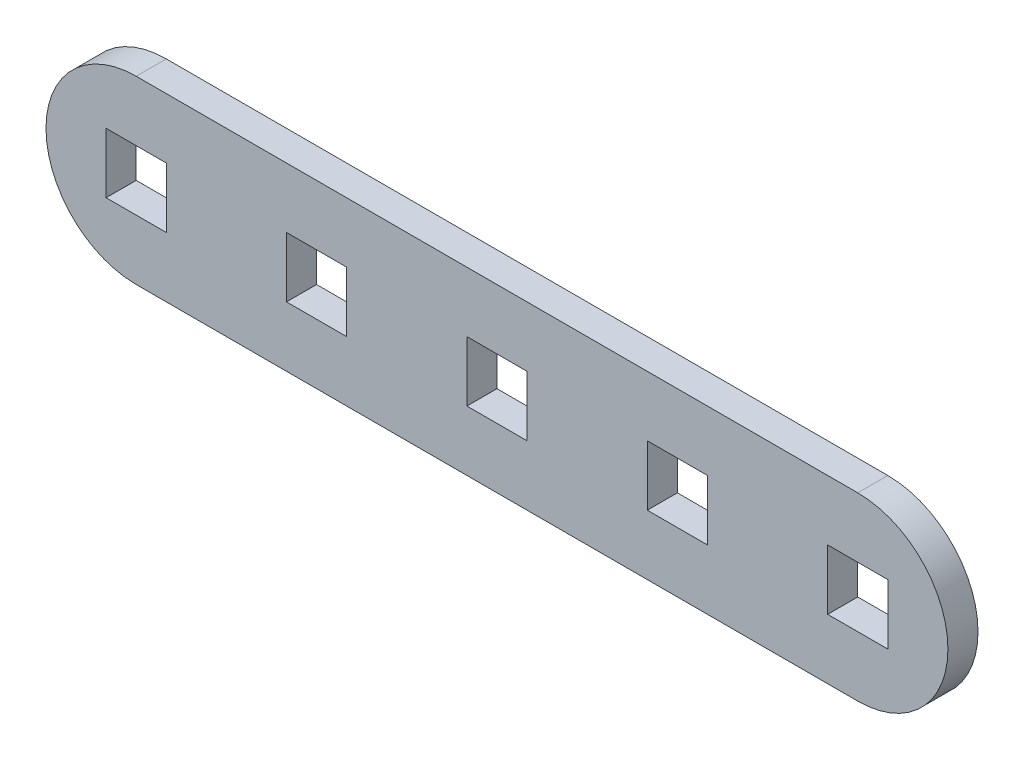
ISO-10303-21;
HEADER;
FILE_DESCRIPTION(('STEP AP214'),'2;1');
FILE_NAME('part.step','',(''),(''),'','','');
FILE_SCHEMA(('AUTOMOTIVE_DESIGN { 1 0 10303 214 1 1 1 1 }'));
ENDSEC;
DATA;
#1=APPLICATION_CONTEXT('core data for automotive mechanical design processes');
#2=APPLICATION_PROTOCOL_DEFINITION('international standard','automotive_design',2000,#1);
#3=PRODUCT_CONTEXT('',#1,'mechanical');
#4=PRODUCT('Part','Part','',(#3));
#5=PRODUCT_RELATED_PRODUCT_CATEGORY('part','',(#4));
#6=PRODUCT_DEFINITION_FORMATION('','',#4);
#7=PRODUCT_DEFINITION_CONTEXT('part definition',#1,'design');
#8=PRODUCT_DEFINITION('design','',#6,#7);
#9=PRODUCT_DEFINITION_SHAPE('','',#8);
#10=(LENGTH_UNIT() NAMED_UNIT(*) SI_UNIT(.MILLI.,.METRE.));
#11=(NAMED_UNIT(*) PLANE_ANGLE_UNIT() SI_UNIT($,.RADIAN.));
#12=(NAMED_UNIT(*) SI_UNIT($,.STERADIAN.) SOLID_ANGLE_UNIT());
#13=UNCERTAINTY_MEASURE_WITH_UNIT(LENGTH_MEASURE(1.E-05),#10,'distance_accuracy_value','');
#14=(GEOMETRIC_REPRESENTATION_CONTEXT(3) GLOBAL_UNCERTAINTY_ASSIGNED_CONTEXT((#13)) GLOBAL_UNIT_ASSIGNED_CONTEXT((#10,
#11,#12)) REPRESENTATION_CONTEXT('',''));
#15=CARTESIAN_POINT('',(0.,0.,0.));
#16=DIRECTION('',(0.,0.,1.));
#17=DIRECTION('',(1.,0.,0.));
#18=AXIS2_PLACEMENT_3D('',#15,#16,#17);
#19=CARTESIAN_POINT('',(47.4127492026,292.7399229362,1.5));
#20=DIRECTION('',(0.,0.,1.));
#21=DIRECTION('',(1.,0.,0.));
#22=AXIS2_PLACEMENT_3D('',#19,#20,#21);
#23=PLANE('',#22);
#24=DIRECTION('',(0.,-1.,0.));
#25=VECTOR('',#24,1.);
#26=CARTESIAN_POINT('',(36.9127492026,294.2399229362,1.5));
#27=LINE('',#26,#25);
#28=CARTESIAN_POINT('',(36.9127492026,294.2399229362,1.5));
#29=VERTEX_POINT('',#28);
#30=CARTESIAN_POINT('',(36.9127492026,291.2399229362,1.5));
#31=VERTEX_POINT('',#30);
#32=EDGE_CURVE('E232',#29,#31,#27,.T.);
#33=ORIENTED_EDGE('',*,*,#32,.F.);
#34=DIRECTION('',(-1.,0.,0.));
#35=VECTOR('',#34,1.);
#36=CARTESIAN_POINT('',(39.9127492026,294.2399229362,1.5));
#37=LINE('',#36,#35);
#38=CARTESIAN_POINT('',(39.9127492026,294.2399229362,1.5));
#39=VERTEX_POINT('',#38);
#40=EDGE_CURVE('E230',#39,#29,#37,.T.);
#41=ORIENTED_EDGE('',*,*,#40,.F.);
#42=DIRECTION('',(0.,1.,0.));
#43=VECTOR('',#42,1.);
#44=CARTESIAN_POINT('',(39.9127492026,291.2399229362,1.5));
#45=LINE('',#44,#43);
#46=CARTESIAN_POINT('',(39.9127492026,291.2399229362,1.5));
#47=VERTEX_POINT('',#46);
#48=EDGE_CURVE('E238',#47,#39,#45,.T.);
#49=ORIENTED_EDGE('',*,*,#48,.F.);
#50=DIRECTION('',(1.,0.,0.));
#51=VECTOR('',#50,1.);
#52=CARTESIAN_POINT('',(36.9127492026,291.2399229362,1.5));
#53=LINE('',#52,#51);
#54=EDGE_CURVE('E235',#31,#47,#53,.T.);
#55=ORIENTED_EDGE('',*,*,#54,.F.);
#56=EDGE_LOOP('',(#33,#41,#49,#55));
#57=FACE_BOUND('',#56,.T.);
#58=DIRECTION('',(0.,-1.,0.));
#59=VECTOR('',#58,1.);
#60=CARTESIAN_POINT('',(18.9127492026,294.2399229362,1.5));
#61=LINE('',#60,#59);
#62=CARTESIAN_POINT('',(18.9127492026,294.2399229362,1.5));
#63=VERTEX_POINT('',#62);
#64=CARTESIAN_POINT('',(18.9127492026,291.2399229362,1.5));
#65=VERTEX_POINT('',#64);
#66=EDGE_CURVE('E294',#63,#65,#61,.T.);
#67=ORIENTED_EDGE('',*,*,#66,.F.);
#68=DIRECTION('',(-1.,0.,0.));
#69=VECTOR('',#68,1.);
#70=CARTESIAN_POINT('',(21.9127492026,294.2399229362,1.5));
#71=LINE('',#70,#69);
#72=CARTESIAN_POINT('',(21.9127492026,294.2399229362,1.5));
#73=VERTEX_POINT('',#72);
#74=EDGE_CURVE('E292',#73,#63,#71,.T.);
#75=ORIENTED_EDGE('',*,*,#74,.F.);
#76=DIRECTION('',(0.,1.,0.));
#77=VECTOR('',#76,1.);
#78=CARTESIAN_POINT('',(21.9127492026,291.2399229362,1.5));
#79=LINE('',#78,#77);
#80=CARTESIAN_POINT('',(21.9127492026,291.2399229362,1.5));
#81=VERTEX_POINT('',#80);
#82=EDGE_CURVE('E300',#81,#73,#79,.T.);
#83=ORIENTED_EDGE('',*,*,#82,.F.);
#84=DIRECTION('',(1.,0.,0.));
#85=VECTOR('',#84,1.);
#86=CARTESIAN_POINT('',(18.9127492026,291.2399229362,1.5));
#87=LINE('',#86,#85);
#88=EDGE_CURVE('E297',#65,#81,#87,.T.);
#89=ORIENTED_EDGE('',*,*,#88,.F.);
#90=EDGE_LOOP('',(#67,#75,#83,#89));
#91=FACE_BOUND('',#90,.T.);
#92=CARTESIAN_POINT('',(47.4127492026,292.7399229362,1.5));
#93=DIRECTION('',(0.,0.,1.));
#94=DIRECTION('',(1.,0.,0.));
#95=AXIS2_PLACEMENT_3D('',#92,#93,#94);
#96=CIRCLE('',#95,4.5);
#97=CARTESIAN_POINT('',(47.4127492026,288.2399229362,1.5));
#98=VERTEX_POINT('',#97);
#99=CARTESIAN_POINT('',(47.4127492026,297.2399229362,1.5));
#100=VERTEX_POINT('',#99);
#101=EDGE_CURVE('E354',#98,#100,#96,.T.);
#102=ORIENTED_EDGE('',*,*,#101,.T.);
#103=DIRECTION('',(-1.,0.,0.));
#104=VECTOR('',#103,1.);
#105=CARTESIAN_POINT('',(11.4127492026,297.2399229362,1.5));
#106=LINE('',#105,#104);
#107=CARTESIAN_POINT('',(11.4127492026,297.2399229362,1.5));
#108=VERTEX_POINT('',#107);
#109=EDGE_CURVE('E357',#100,#108,#106,.T.);
#110=ORIENTED_EDGE('',*,*,#109,.T.);
#111=CARTESIAN_POINT('',(11.4127492026,292.7399229362,1.5));
#112=DIRECTION('',(0.,0.,1.));
#113=DIRECTION('',(1.,0.,0.));
#114=AXIS2_PLACEMENT_3D('',#111,#112,#113);
#115=CIRCLE('',#114,4.5);
#116=CARTESIAN_POINT('',(11.4127492026,288.2399229362,1.5));
#117=VERTEX_POINT('',#116);
#118=EDGE_CURVE('E360',#108,#117,#115,.T.);
#119=ORIENTED_EDGE('',*,*,#118,.T.);
#120=DIRECTION('',(1.,0.,0.));
#121=VECTOR('',#120,1.);
#122=CARTESIAN_POINT('',(11.4127492026,288.2399229362,1.5));
#123=LINE('',#122,#121);
#124=EDGE_CURVE('E362',#117,#98,#123,.T.);
#125=ORIENTED_EDGE('',*,*,#124,.T.);
#126=EDGE_LOOP('',(#102,#110,#119,#125));
#127=FACE_BOUND('',#126,.T.);
#128=DIRECTION('',(0.,-1.,0.));
#129=VECTOR('',#128,1.);
#130=CARTESIAN_POINT('',(9.9127492026,294.2399229362,1.5));
#131=LINE('',#130,#129);
#132=CARTESIAN_POINT('',(9.9127492026,294.2399229362,1.5));
#133=VERTEX_POINT('',#132);
#134=CARTESIAN_POINT('',(9.9127492026,291.2399229362,1.5));
#135=VERTEX_POINT('',#134);
#136=EDGE_CURVE('E325',#133,#135,#131,.T.);
#137=ORIENTED_EDGE('',*,*,#136,.F.);
#138=DIRECTION('',(-1.,0.,0.));
#139=VECTOR('',#138,1.);
#140=CARTESIAN_POINT('',(12.9127492026,294.2399229362,1.5));
#141=LINE('',#140,#139);
#142=CARTESIAN_POINT('',(12.9127492026,294.2399229362,1.5));
#143=VERTEX_POINT('',#142);
#144=EDGE_CURVE('E323',#143,#133,#141,.T.);
#145=ORIENTED_EDGE('',*,*,#144,.F.);
#146=DIRECTION('',(0.,1.,0.));
#147=VECTOR('',#146,1.);
#148=CARTESIAN_POINT('',(12.9127492026,291.2399229362,1.5));
#149=LINE('',#148,#147);
#150=CARTESIAN_POINT('',(12.9127492026,291.2399229362,1.5));
#151=VERTEX_POINT('',#150);
#152=EDGE_CURVE('E331',#151,#143,#149,.T.);
#153=ORIENTED_EDGE('',*,*,#152,.F.);
#154=DIRECTION('',(1.,0.,0.));
#155=VECTOR('',#154,1.);
#156=CARTESIAN_POINT('',(9.9127492026,291.2399229362,1.5));
#157=LINE('',#156,#155);
#158=EDGE_CURVE('E328',#135,#151,#157,.T.);
#159=ORIENTED_EDGE('',*,*,#158,.F.);
#160=EDGE_LOOP('',(#137,#145,#153,#159));
#161=FACE_BOUND('',#160,.T.);
#162=DIRECTION('',(0.,-1.,0.));
#163=VECTOR('',#162,1.);
#164=CARTESIAN_POINT('',(27.9127492026,294.2399229362,1.5));
#165=LINE('',#164,#163);
#166=CARTESIAN_POINT('',(27.9127492026,294.2399229362,1.5));
#167=VERTEX_POINT('',#166);
#168=CARTESIAN_POINT('',(27.9127492026,291.2399229362,1.5));
#169=VERTEX_POINT('',#168);
#170=EDGE_CURVE('E263',#167,#169,#165,.T.);
#171=ORIENTED_EDGE('',*,*,#170,.F.);
#172=DIRECTION('',(-1.,0.,0.));
#173=VECTOR('',#172,1.);
#174=CARTESIAN_POINT('',(30.9127492026,294.2399229362,1.5));
#175=LINE('',#174,#173);
#176=CARTESIAN_POINT('',(30.9127492026,294.2399229362,1.5));
#177=VERTEX_POINT('',#176);
#178=EDGE_CURVE('E261',#177,#167,#175,.T.);
#179=ORIENTED_EDGE('',*,*,#178,.F.);
#180=DIRECTION('',(0.,1.,0.));
#181=VECTOR('',#180,1.);
#182=CARTESIAN_POINT('',(30.9127492026,291.2399229362,1.5));
#183=LINE('',#182,#181);
#184=CARTESIAN_POINT('',(30.9127492026,291.2399229362,1.5));
#185=VERTEX_POINT('',#184);
#186=EDGE_CURVE('E269',#185,#177,#183,.T.);
#187=ORIENTED_EDGE('',*,*,#186,.F.);
#188=DIRECTION('',(1.,0.,0.));
#189=VECTOR('',#188,1.);
#190=CARTESIAN_POINT('',(27.9127492026,291.2399229362,1.5));
#191=LINE('',#190,#189);
#192=EDGE_CURVE('E266',#169,#185,#191,.T.);
#193=ORIENTED_EDGE('',*,*,#192,.F.);
#194=EDGE_LOOP('',(#171,#179,#187,#193));
#195=FACE_BOUND('',#194,.T.);
#196=DIRECTION('',(0.,-1.,0.));
#197=VECTOR('',#196,1.);
#198=CARTESIAN_POINT('',(45.9127492026,294.2399229362,1.5));
#199=LINE('',#198,#197);
#200=CARTESIAN_POINT('',(45.9127492026,294.2399229362,1.5));
#201=VERTEX_POINT('',#200);
#202=CARTESIAN_POINT('',(45.9127492026,291.2399229362,1.5));
#203=VERTEX_POINT('',#202);
#204=EDGE_CURVE('E202',#201,#203,#199,.T.);
#205=ORIENTED_EDGE('',*,*,#204,.F.);
#206=DIRECTION('',(-1.,0.,0.));
#207=VECTOR('',#206,1.);
#208=CARTESIAN_POINT('',(48.9127492026,294.2399229362,1.5));
#209=LINE('',#208,#207);
#210=CARTESIAN_POINT('',(48.9127492026,294.2399229362,1.5));
#211=VERTEX_POINT('',#210);
#212=EDGE_CURVE('E194',#211,#201,#209,.T.);
#213=ORIENTED_EDGE('',*,*,#212,.F.);
#214=DIRECTION('',(0.,1.,0.));
#215=VECTOR('',#214,1.);
#216=CARTESIAN_POINT('',(48.9127492026,291.2399229362,1.5));
#217=LINE('',#216,#215);
#218=CARTESIAN_POINT('',(48.9127492026,291.2399229362,1.5));
#219=VERTEX_POINT('',#218);
#220=EDGE_CURVE('E216',#219,#211,#217,.T.);
#221=ORIENTED_EDGE('',*,*,#220,.F.);
#222=DIRECTION('',(1.,0.,0.));
#223=VECTOR('',#222,1.);
#224=CARTESIAN_POINT('',(45.9127492026,291.2399229362,1.5));
#225=LINE('',#224,#223);
#226=EDGE_CURVE('E214',#203,#219,#225,.T.);
#227=ORIENTED_EDGE('',*,*,#226,.F.);
#228=EDGE_LOOP('',(#205,#213,#221,#227));
#229=FACE_BOUND('',#228,.T.);
#230=ADVANCED_FACE('F33',(#57,#91,#127,#161,#195,#229),#23,.T.);
#231=CARTESIAN_POINT('',(47.4127492026,292.7399229362,0.));
#232=DIRECTION('',(0.,0.,1.));
#233=DIRECTION('',(1.,0.,0.));
#234=AXIS2_PLACEMENT_3D('',#231,#232,#233);
#235=PLANE('',#234);
#236=DIRECTION('',(-1.,0.,0.));
#237=VECTOR('',#236,1.);
#238=CARTESIAN_POINT('',(39.9127492026,294.2399229362,0.));
#239=LINE('',#238,#237);
#240=CARTESIAN_POINT('',(39.9127492026,294.2399229362,0.));
#241=VERTEX_POINT('',#240);
#242=CARTESIAN_POINT('',(36.9127492026,294.2399229362,0.));
#243=VERTEX_POINT('',#242);
#244=EDGE_CURVE('E210',#241,#243,#239,.T.);
#245=ORIENTED_EDGE('',*,*,#244,.T.);
#246=DIRECTION('',(0.,-1.,0.));
#247=VECTOR('',#246,1.);
#248=CARTESIAN_POINT('',(36.9127492026,294.2399229362,0.));
#249=LINE('',#248,#247);
#250=CARTESIAN_POINT('',(36.9127492026,291.2399229362,0.));
#251=VERTEX_POINT('',#250);
#252=EDGE_CURVE('E243',#243,#251,#249,.T.);
#253=ORIENTED_EDGE('',*,*,#252,.T.);
#254=DIRECTION('',(1.,0.,0.));
#255=VECTOR('',#254,1.);
#256=CARTESIAN_POINT('',(36.9127492026,291.2399229362,0.));
#257=LINE('',#256,#255);
#258=CARTESIAN_POINT('',(39.9127492026,291.2399229362,0.));
#259=VERTEX_POINT('',#258);
#260=EDGE_CURVE('E246',#251,#259,#257,.T.);
#261=ORIENTED_EDGE('',*,*,#260,.T.);
#262=DIRECTION('',(0.,1.,0.));
#263=VECTOR('',#262,1.);
#264=CARTESIAN_POINT('',(39.9127492026,291.2399229362,0.));
#265=LINE('',#264,#263);
#266=EDGE_CURVE('E233',#259,#241,#265,.T.);
#267=ORIENTED_EDGE('',*,*,#266,.T.);
#268=EDGE_LOOP('',(#245,#253,#261,#267));
#269=FACE_BOUND('',#268,.T.);
#270=DIRECTION('',(-1.,0.,0.));
#271=VECTOR('',#270,1.);
#272=CARTESIAN_POINT('',(21.9127492026,294.2399229362,0.));
#273=LINE('',#272,#271);
#274=CARTESIAN_POINT('',(21.9127492026,294.2399229362,0.));
#275=VERTEX_POINT('',#274);
#276=CARTESIAN_POINT('',(18.9127492026,294.2399229362,0.));
#277=VERTEX_POINT('',#276);
#278=EDGE_CURVE('E291',#275,#277,#273,.T.);
#279=ORIENTED_EDGE('',*,*,#278,.T.);
#280=DIRECTION('',(0.,-1.,0.));
#281=VECTOR('',#280,1.);
#282=CARTESIAN_POINT('',(18.9127492026,294.2399229362,0.));
#283=LINE('',#282,#281);
#284=CARTESIAN_POINT('',(18.9127492026,291.2399229362,0.));
#285=VERTEX_POINT('',#284);
#286=EDGE_CURVE('E305',#277,#285,#283,.T.);
#287=ORIENTED_EDGE('',*,*,#286,.T.);
#288=DIRECTION('',(1.,0.,0.));
#289=VECTOR('',#288,1.);
#290=CARTESIAN_POINT('',(18.9127492026,291.2399229362,0.));
#291=LINE('',#290,#289);
#292=CARTESIAN_POINT('',(21.9127492026,291.2399229362,0.));
#293=VERTEX_POINT('',#292);
#294=EDGE_CURVE('E308',#285,#293,#291,.T.);
#295=ORIENTED_EDGE('',*,*,#294,.T.);
#296=DIRECTION('',(0.,1.,0.));
#297=VECTOR('',#296,1.);
#298=CARTESIAN_POINT('',(21.9127492026,291.2399229362,0.));
#299=LINE('',#298,#297);
#300=EDGE_CURVE('E295',#293,#275,#299,.T.);
#301=ORIENTED_EDGE('',*,*,#300,.T.);
#302=EDGE_LOOP('',(#279,#287,#295,#301));
#303=FACE_BOUND('',#302,.T.);
#304=CARTESIAN_POINT('',(47.4127492026,292.7399229362,0.));
#305=DIRECTION('',(0.,0.,1.));
#306=DIRECTION('',(1.,0.,0.));
#307=AXIS2_PLACEMENT_3D('',#304,#305,#306);
#308=CIRCLE('',#307,4.5);
#309=CARTESIAN_POINT('',(47.4127492026,288.2399229362,0.));
#310=VERTEX_POINT('',#309);
#311=CARTESIAN_POINT('',(47.4127492026,297.2399229362,0.));
#312=VERTEX_POINT('',#311);
#313=EDGE_CURVE('E353',#310,#312,#308,.T.);
#314=ORIENTED_EDGE('',*,*,#313,.F.);
#315=DIRECTION('',(1.,0.,0.));
#316=VECTOR('',#315,1.);
#317=CARTESIAN_POINT('',(11.4127492026,288.2399229362,0.));
#318=LINE('',#317,#316);
#319=CARTESIAN_POINT('',(11.4127492026,288.2399229362,0.));
#320=VERTEX_POINT('',#319);
#321=EDGE_CURVE('E358',#320,#310,#318,.T.);
#322=ORIENTED_EDGE('',*,*,#321,.F.);
#323=CARTESIAN_POINT('',(11.4127492026,292.7399229362,0.));
#324=DIRECTION('',(0.,0.,1.));
#325=DIRECTION('',(1.,0.,0.));
#326=AXIS2_PLACEMENT_3D('',#323,#324,#325);
#327=CIRCLE('',#326,4.5);
#328=CARTESIAN_POINT('',(11.4127492026,297.2399229362,0.));
#329=VERTEX_POINT('',#328);
#330=EDGE_CURVE('E369',#329,#320,#327,.T.);
#331=ORIENTED_EDGE('',*,*,#330,.F.);
#332=DIRECTION('',(-1.,0.,0.));
#333=VECTOR('',#332,1.);
#334=CARTESIAN_POINT('',(11.4127492026,297.2399229362,0.));
#335=LINE('',#334,#333);
#336=EDGE_CURVE('E367',#312,#329,#335,.T.);
#337=ORIENTED_EDGE('',*,*,#336,.F.);
#338=EDGE_LOOP('',(#314,#322,#331,#337));
#339=FACE_BOUND('',#338,.T.);
#340=DIRECTION('',(-1.,0.,0.));
#341=VECTOR('',#340,1.);
#342=CARTESIAN_POINT('',(12.9127492026,294.2399229362,0.));
#343=LINE('',#342,#341);
#344=CARTESIAN_POINT('',(12.9127492026,294.2399229362,0.));
#345=VERTEX_POINT('',#344);
#346=CARTESIAN_POINT('',(9.9127492026,294.2399229362,0.));
#347=VERTEX_POINT('',#346);
#348=EDGE_CURVE('E322',#345,#347,#343,.T.);
#349=ORIENTED_EDGE('',*,*,#348,.T.);
#350=DIRECTION('',(0.,-1.,0.));
#351=VECTOR('',#350,1.);
#352=CARTESIAN_POINT('',(9.9127492026,294.2399229362,0.));
#353=LINE('',#352,#351);
#354=CARTESIAN_POINT('',(9.9127492026,291.2399229362,0.));
#355=VERTEX_POINT('',#354);
#356=EDGE_CURVE('E336',#347,#355,#353,.T.);
#357=ORIENTED_EDGE('',*,*,#356,.T.);
#358=DIRECTION('',(1.,0.,0.));
#359=VECTOR('',#358,1.);
#360=CARTESIAN_POINT('',(9.9127492026,291.2399229362,0.));
#361=LINE('',#360,#359);
#362=CARTESIAN_POINT('',(12.9127492026,291.2399229362,0.));
#363=VERTEX_POINT('',#362);
#364=EDGE_CURVE('E339',#355,#363,#361,.T.);
#365=ORIENTED_EDGE('',*,*,#364,.T.);
#366=DIRECTION('',(0.,1.,0.));
#367=VECTOR('',#366,1.);
#368=CARTESIAN_POINT('',(12.9127492026,291.2399229362,0.));
#369=LINE('',#368,#367);
#370=EDGE_CURVE('E326',#363,#345,#369,.T.);
#371=ORIENTED_EDGE('',*,*,#370,.T.);
#372=EDGE_LOOP('',(#349,#357,#365,#371));
#373=FACE_BOUND('',#372,.T.);
#374=DIRECTION('',(-1.,0.,0.));
#375=VECTOR('',#374,1.);
#376=CARTESIAN_POINT('',(30.9127492026,294.2399229362,0.));
#377=LINE('',#376,#375);
#378=CARTESIAN_POINT('',(30.9127492026,294.2399229362,0.));
#379=VERTEX_POINT('',#378);
#380=CARTESIAN_POINT('',(27.9127492026,294.2399229362,0.));
#381=VERTEX_POINT('',#380);
#382=EDGE_CURVE('E260',#379,#381,#377,.T.);
#383=ORIENTED_EDGE('',*,*,#382,.T.);
#384=DIRECTION('',(0.,-1.,0.));
#385=VECTOR('',#384,1.);
#386=CARTESIAN_POINT('',(27.9127492026,294.2399229362,0.));
#387=LINE('',#386,#385);
#388=CARTESIAN_POINT('',(27.9127492026,291.2399229362,0.));
#389=VERTEX_POINT('',#388);
#390=EDGE_CURVE('E274',#381,#389,#387,.T.);
#391=ORIENTED_EDGE('',*,*,#390,.T.);
#392=DIRECTION('',(1.,0.,0.));
#393=VECTOR('',#392,1.);
#394=CARTESIAN_POINT('',(27.9127492026,291.2399229362,0.));
#395=LINE('',#394,#393);
#396=CARTESIAN_POINT('',(30.9127492026,291.2399229362,0.));
#397=VERTEX_POINT('',#396);
#398=EDGE_CURVE('E277',#389,#397,#395,.T.);
#399=ORIENTED_EDGE('',*,*,#398,.T.);
#400=DIRECTION('',(0.,1.,0.));
#401=VECTOR('',#400,1.);
#402=CARTESIAN_POINT('',(30.9127492026,291.2399229362,0.));
#403=LINE('',#402,#401);
#404=EDGE_CURVE('E264',#397,#379,#403,.T.);
#405=ORIENTED_EDGE('',*,*,#404,.T.);
#406=EDGE_LOOP('',(#383,#391,#399,#405));
#407=FACE_BOUND('',#406,.T.);
#408=DIRECTION('',(-1.,0.,0.));
#409=VECTOR('',#408,1.);
#410=CARTESIAN_POINT('',(48.9127492026,294.2399229362,0.));
#411=LINE('',#410,#409);
#412=CARTESIAN_POINT('',(48.9127492026,294.2399229362,0.));
#413=VERTEX_POINT('',#412);
#414=CARTESIAN_POINT('',(45.9127492026,294.2399229362,0.));
#415=VERTEX_POINT('',#414);
#416=EDGE_CURVE('E56',#413,#415,#411,.T.);
#417=ORIENTED_EDGE('',*,*,#416,.T.);
#418=DIRECTION('',(0.,-1.,0.));
#419=VECTOR('',#418,1.);
#420=CARTESIAN_POINT('',(45.9127492026,294.2399229362,0.));
#421=LINE('',#420,#419);
#422=CARTESIAN_POINT('',(45.9127492026,291.2399229362,0.));
#423=VERTEX_POINT('',#422);
#424=EDGE_CURVE('E209',#415,#423,#421,.T.);
#425=ORIENTED_EDGE('',*,*,#424,.T.);
#426=DIRECTION('',(1.,0.,0.));
#427=VECTOR('',#426,1.);
#428=CARTESIAN_POINT('',(45.9127492026,291.2399229362,0.));
#429=LINE('',#428,#427);
#430=CARTESIAN_POINT('',(48.9127492026,291.2399229362,0.));
#431=VERTEX_POINT('',#430);
#432=EDGE_CURVE('E222',#423,#431,#429,.T.);
#433=ORIENTED_EDGE('',*,*,#432,.T.);
#434=DIRECTION('',(0.,1.,0.));
#435=VECTOR('',#434,1.);
#436=CARTESIAN_POINT('',(48.9127492026,291.2399229362,0.));
#437=LINE('',#436,#435);
#438=EDGE_CURVE('E203',#431,#413,#437,.T.);
#439=ORIENTED_EDGE('',*,*,#438,.T.);
#440=EDGE_LOOP('',(#417,#425,#433,#439));
#441=FACE_BOUND('',#440,.T.);
#442=ADVANCED_FACE('F387',(#269,#303,#339,#373,#407,#441),#235,.F.);
#443=CARTESIAN_POINT('',(47.4127492026,292.7399229362,1.5));
#444=DIRECTION('',(0.,0.,-1.));
#445=DIRECTION('',(-1.,0.,0.));
#446=AXIS2_PLACEMENT_3D('',#443,#444,#445);
#447=CYLINDRICAL_SURFACE('',#446,4.5);
#448=ORIENTED_EDGE('',*,*,#313,.T.);
#449=DIRECTION('',(0.,0.,-1.));
#450=VECTOR('',#449,1.);
#451=CARTESIAN_POINT('',(47.4127492026,297.2399229362,1.5));
#452=LINE('',#451,#450);
#453=EDGE_CURVE('E11',#100,#312,#452,.T.);
#454=ORIENTED_EDGE('',*,*,#453,.F.);
#455=ORIENTED_EDGE('',*,*,#101,.F.);
#456=DIRECTION('',(0.,0.,-1.));
#457=VECTOR('',#456,1.);
#458=CARTESIAN_POINT('',(47.4127492026,288.2399229362,1.5));
#459=LINE('',#458,#457);
#460=EDGE_CURVE('E364',#98,#310,#459,.T.);
#461=ORIENTED_EDGE('',*,*,#460,.T.);
#462=EDGE_LOOP('',(#448,#454,#455,#461));
#463=FACE_BOUND('',#462,.T.);
#464=ADVANCED_FACE('F35',(#463),#447,.T.);
#465=CARTESIAN_POINT('',(11.4127492026,297.2399229362,1.5));
#466=DIRECTION('',(0.,-1.,0.));
#467=DIRECTION('',(0.,0.,-1.));
#468=AXIS2_PLACEMENT_3D('',#465,#466,#467);
#469=PLANE('',#468);
#470=ORIENTED_EDGE('',*,*,#336,.T.);
#471=DIRECTION('',(0.,0.,-1.));
#472=VECTOR('',#471,1.);
#473=CARTESIAN_POINT('',(11.4127492026,297.2399229362,1.5));
#474=LINE('',#473,#472);
#475=EDGE_CURVE('E41',#108,#329,#474,.T.);
#476=ORIENTED_EDGE('',*,*,#475,.F.);
#477=ORIENTED_EDGE('',*,*,#109,.F.);
#478=ORIENTED_EDGE('',*,*,#453,.T.);
#479=EDGE_LOOP('',(#470,#476,#477,#478));
#480=FACE_BOUND('',#479,.T.);
#481=ADVANCED_FACE('F398',(#480),#469,.F.);
#482=CARTESIAN_POINT('',(11.4127492026,292.7399229362,1.5));
#483=DIRECTION('',(0.,0.,-1.));
#484=DIRECTION('',(-1.,0.,0.));
#485=AXIS2_PLACEMENT_3D('',#482,#483,#484);
#486=CYLINDRICAL_SURFACE('',#485,4.5);
#487=ORIENTED_EDGE('',*,*,#330,.T.);
#488=DIRECTION('',(0.,0.,-1.));
#489=VECTOR('',#488,1.);
#490=CARTESIAN_POINT('',(11.4127492026,288.2399229362,1.5));
#491=LINE('',#490,#489);
#492=EDGE_CURVE('E374',#117,#320,#491,.T.);
#493=ORIENTED_EDGE('',*,*,#492,.F.);
#494=ORIENTED_EDGE('',*,*,#118,.F.);
#495=ORIENTED_EDGE('',*,*,#475,.T.);
#496=EDGE_LOOP('',(#487,#493,#494,#495));
#497=FACE_BOUND('',#496,.T.);
#498=ADVANCED_FACE('F381',(#497),#486,.T.);
#499=CARTESIAN_POINT('',(11.4127492026,288.2399229362,1.5));
#500=DIRECTION('',(0.,1.,0.));
#501=DIRECTION('',(0.,0.,1.));
#502=AXIS2_PLACEMENT_3D('',#499,#500,#501);
#503=PLANE('',#502);
#504=ORIENTED_EDGE('',*,*,#321,.T.);
#505=ORIENTED_EDGE('',*,*,#460,.F.);
#506=ORIENTED_EDGE('',*,*,#124,.F.);
#507=ORIENTED_EDGE('',*,*,#492,.T.);
#508=EDGE_LOOP('',(#504,#505,#506,#507));
#509=FACE_BOUND('',#508,.T.);
#510=ADVANCED_FACE('F391',(#509),#503,.F.);
#511=CARTESIAN_POINT('',(12.9127492026,294.2399229362,1.5));
#512=DIRECTION('',(0.,-1.,0.));
#513=DIRECTION('',(0.,0.,-1.));
#514=AXIS2_PLACEMENT_3D('',#511,#512,#513);
#515=PLANE('',#514);
#516=ORIENTED_EDGE('',*,*,#348,.F.);
#517=DIRECTION('',(0.,0.,-1.));
#518=VECTOR('',#517,1.);
#519=CARTESIAN_POINT('',(12.9127492026,294.2399229362,1.5));
#520=LINE('',#519,#518);
#521=EDGE_CURVE('E333',#143,#345,#520,.T.);
#522=ORIENTED_EDGE('',*,*,#521,.F.);
#523=ORIENTED_EDGE('',*,*,#144,.T.);
#524=DIRECTION('',(0.,0.,-1.));
#525=VECTOR('',#524,1.);
#526=CARTESIAN_POINT('',(9.9127492026,294.2399229362,1.5));
#527=LINE('',#526,#525);
#528=EDGE_CURVE('E350',#133,#347,#527,.T.);
#529=ORIENTED_EDGE('',*,*,#528,.T.);
#530=EDGE_LOOP('',(#516,#522,#523,#529));
#531=FACE_BOUND('',#530,.T.);
#532=ADVANCED_FACE('F416',(#531),#515,.T.);
#533=CARTESIAN_POINT('',(9.9127492026,294.2399229362,1.5));
#534=DIRECTION('',(1.,0.,0.));
#535=DIRECTION('',(0.,0.,-1.));
#536=AXIS2_PLACEMENT_3D('',#533,#534,#535);
#537=PLANE('',#536);
#538=ORIENTED_EDGE('',*,*,#356,.F.);
#539=ORIENTED_EDGE('',*,*,#528,.F.);
#540=ORIENTED_EDGE('',*,*,#136,.T.);
#541=DIRECTION('',(0.,0.,-1.));
#542=VECTOR('',#541,1.);
#543=CARTESIAN_POINT('',(9.9127492026,291.2399229362,1.5));
#544=LINE('',#543,#542);
#545=EDGE_CURVE('E348',#135,#355,#544,.T.);
#546=ORIENTED_EDGE('',*,*,#545,.T.);
#547=EDGE_LOOP('',(#538,#539,#540,#546));
#548=FACE_BOUND('',#547,.T.);
#549=ADVANCED_FACE('F423',(#548),#537,.T.);
#550=CARTESIAN_POINT('',(9.9127492026,291.2399229362,1.5));
#551=DIRECTION('',(0.,1.,0.));
#552=DIRECTION('',(0.,0.,1.));
#553=AXIS2_PLACEMENT_3D('',#550,#551,#552);
#554=PLANE('',#553);
#555=ORIENTED_EDGE('',*,*,#364,.F.);
#556=ORIENTED_EDGE('',*,*,#545,.F.);
#557=ORIENTED_EDGE('',*,*,#158,.T.);
#558=DIRECTION('',(0.,0.,-1.));
#559=VECTOR('',#558,1.);
#560=CARTESIAN_POINT('',(12.9127492026,291.2399229362,1.5));
#561=LINE('',#560,#559);
#562=EDGE_CURVE('E346',#151,#363,#561,.T.);
#563=ORIENTED_EDGE('',*,*,#562,.T.);
#564=EDGE_LOOP('',(#555,#556,#557,#563));
#565=FACE_BOUND('',#564,.T.);
#566=ADVANCED_FACE('F428',(#565),#554,.T.);
#567=CARTESIAN_POINT('',(12.9127492026,291.2399229362,1.5));
#568=DIRECTION('',(-1.,0.,0.));
#569=DIRECTION('',(0.,0.,1.));
#570=AXIS2_PLACEMENT_3D('',#567,#568,#569);
#571=PLANE('',#570);
#572=ORIENTED_EDGE('',*,*,#370,.F.);
#573=ORIENTED_EDGE('',*,*,#562,.F.);
#574=ORIENTED_EDGE('',*,*,#152,.T.);
#575=ORIENTED_EDGE('',*,*,#521,.T.);
#576=EDGE_LOOP('',(#572,#573,#574,#575));
#577=FACE_BOUND('',#576,.T.);
#578=ADVANCED_FACE('F435',(#577),#571,.T.);
#579=CARTESIAN_POINT('',(21.9127492026,294.2399229362,1.5));
#580=DIRECTION('',(0.,-1.,0.));
#581=DIRECTION('',(0.,0.,-1.));
#582=AXIS2_PLACEMENT_3D('',#579,#580,#581);
#583=PLANE('',#582);
#584=ORIENTED_EDGE('',*,*,#278,.F.);
#585=DIRECTION('',(0.,0.,-1.));
#586=VECTOR('',#585,1.);
#587=CARTESIAN_POINT('',(21.9127492026,294.2399229362,1.5));
#588=LINE('',#587,#586);
#589=EDGE_CURVE('E302',#73,#275,#588,.T.);
#590=ORIENTED_EDGE('',*,*,#589,.F.);
#591=ORIENTED_EDGE('',*,*,#74,.T.);
#592=DIRECTION('',(0.,0.,-1.));
#593=VECTOR('',#592,1.);
#594=CARTESIAN_POINT('',(18.9127492026,294.2399229362,1.5));
#595=LINE('',#594,#593);
#596=EDGE_CURVE('E319',#63,#277,#595,.T.);
#597=ORIENTED_EDGE('',*,*,#596,.T.);
#598=EDGE_LOOP('',(#584,#590,#591,#597));
#599=FACE_BOUND('',#598,.T.);
#600=ADVANCED_FACE('F490',(#599),#583,.T.);
#601=CARTESIAN_POINT('',(18.9127492026,294.2399229362,1.5));
#602=DIRECTION('',(1.,0.,0.));
#603=DIRECTION('',(0.,0.,-1.));
#604=AXIS2_PLACEMENT_3D('',#601,#602,#603);
#605=PLANE('',#604);
#606=ORIENTED_EDGE('',*,*,#286,.F.);
#607=ORIENTED_EDGE('',*,*,#596,.F.);
#608=ORIENTED_EDGE('',*,*,#66,.T.);
#609=DIRECTION('',(0.,0.,-1.));
#610=VECTOR('',#609,1.);
#611=CARTESIAN_POINT('',(18.9127492026,291.2399229362,1.5));
#612=LINE('',#611,#610);
#613=EDGE_CURVE('E317',#65,#285,#612,.T.);
#614=ORIENTED_EDGE('',*,*,#613,.T.);
#615=EDGE_LOOP('',(#606,#607,#608,#614));
#616=FACE_BOUND('',#615,.T.);
#617=ADVANCED_FACE('F486',(#616),#605,.T.);
#618=CARTESIAN_POINT('',(18.9127492026,291.2399229362,1.5));
#619=DIRECTION('',(0.,1.,0.));
#620=DIRECTION('',(0.,0.,1.));
#621=AXIS2_PLACEMENT_3D('',#618,#619,#620);
#622=PLANE('',#621);
#623=ORIENTED_EDGE('',*,*,#294,.F.);
#624=ORIENTED_EDGE('',*,*,#613,.F.);
#625=ORIENTED_EDGE('',*,*,#88,.T.);
#626=DIRECTION('',(0.,0.,-1.));
#627=VECTOR('',#626,1.);
#628=CARTESIAN_POINT('',(21.9127492026,291.2399229362,1.5));
#629=LINE('',#628,#627);
#630=EDGE_CURVE('E315',#81,#293,#629,.T.);
#631=ORIENTED_EDGE('',*,*,#630,.T.);
#632=EDGE_LOOP('',(#623,#624,#625,#631));
#633=FACE_BOUND('',#632,.T.);
#634=ADVANCED_FACE('F482',(#633),#622,.T.);
#635=CARTESIAN_POINT('',(21.9127492026,291.2399229362,1.5));
#636=DIRECTION('',(-1.,0.,0.));
#637=DIRECTION('',(0.,0.,1.));
#638=AXIS2_PLACEMENT_3D('',#635,#636,#637);
#639=PLANE('',#638);
#640=ORIENTED_EDGE('',*,*,#300,.F.);
#641=ORIENTED_EDGE('',*,*,#630,.F.);
#642=ORIENTED_EDGE('',*,*,#82,.T.);
#643=ORIENTED_EDGE('',*,*,#589,.T.);
#644=EDGE_LOOP('',(#640,#641,#642,#643));
#645=FACE_BOUND('',#644,.T.);
#646=ADVANCED_FACE('F479',(#645),#639,.T.);
#647=CARTESIAN_POINT('',(30.9127492026,294.2399229362,1.5));
#648=DIRECTION('',(0.,-1.,0.));
#649=DIRECTION('',(0.,0.,-1.));
#650=AXIS2_PLACEMENT_3D('',#647,#648,#649);
#651=PLANE('',#650);
#652=ORIENTED_EDGE('',*,*,#382,.F.);
#653=DIRECTION('',(0.,0.,-1.));
#654=VECTOR('',#653,1.);
#655=CARTESIAN_POINT('',(30.9127492026,294.2399229362,1.5));
#656=LINE('',#655,#654);
#657=EDGE_CURVE('E271',#177,#379,#656,.T.);
#658=ORIENTED_EDGE('',*,*,#657,.F.);
#659=ORIENTED_EDGE('',*,*,#178,.T.);
#660=DIRECTION('',(0.,0.,-1.));
#661=VECTOR('',#660,1.);
#662=CARTESIAN_POINT('',(27.9127492026,294.2399229362,1.5));
#663=LINE('',#662,#661);
#664=EDGE_CURVE('E288',#167,#381,#663,.T.);
#665=ORIENTED_EDGE('',*,*,#664,.T.);
#666=EDGE_LOOP('',(#652,#658,#659,#665));
#667=FACE_BOUND('',#666,.T.);
#668=ADVANCED_FACE('F458',(#667),#651,.T.);
#669=CARTESIAN_POINT('',(27.9127492026,294.2399229362,1.5));
#670=DIRECTION('',(1.,0.,0.));
#671=DIRECTION('',(0.,0.,-1.));
#672=AXIS2_PLACEMENT_3D('',#669,#670,#671);
#673=PLANE('',#672);
#674=ORIENTED_EDGE('',*,*,#390,.F.);
#675=ORIENTED_EDGE('',*,*,#664,.F.);
#676=ORIENTED_EDGE('',*,*,#170,.T.);
#677=DIRECTION('',(0.,0.,-1.));
#678=VECTOR('',#677,1.);
#679=CARTESIAN_POINT('',(27.9127492026,291.2399229362,1.5));
#680=LINE('',#679,#678);
#681=EDGE_CURVE('E286',#169,#389,#680,.T.);
#682=ORIENTED_EDGE('',*,*,#681,.T.);
#683=EDGE_LOOP('',(#674,#675,#676,#682));
#684=FACE_BOUND('',#683,.T.);
#685=ADVANCED_FACE('F451',(#684),#673,.T.);
#686=CARTESIAN_POINT('',(27.9127492026,291.2399229362,1.5));
#687=DIRECTION('',(0.,1.,0.));
#688=DIRECTION('',(0.,0.,1.));
#689=AXIS2_PLACEMENT_3D('',#686,#687,#688);
#690=PLANE('',#689);
#691=ORIENTED_EDGE('',*,*,#398,.F.);
#692=ORIENTED_EDGE('',*,*,#681,.F.);
#693=ORIENTED_EDGE('',*,*,#192,.T.);
#694=DIRECTION('',(0.,0.,-1.));
#695=VECTOR('',#694,1.);
#696=CARTESIAN_POINT('',(30.9127492026,291.2399229362,1.5));
#697=LINE('',#696,#695);
#698=EDGE_CURVE('E284',#185,#397,#697,.T.);
#699=ORIENTED_EDGE('',*,*,#698,.T.);
#700=EDGE_LOOP('',(#691,#692,#693,#699));
#701=FACE_BOUND('',#700,.T.);
#702=ADVANCED_FACE('F454',(#701),#690,.T.);
#703=CARTESIAN_POINT('',(30.9127492026,291.2399229362,1.5));
#704=DIRECTION('',(-1.,0.,0.));
#705=DIRECTION('',(0.,0.,1.));
#706=AXIS2_PLACEMENT_3D('',#703,#704,#705);
#707=PLANE('',#706);
#708=ORIENTED_EDGE('',*,*,#404,.F.);
#709=ORIENTED_EDGE('',*,*,#698,.F.);
#710=ORIENTED_EDGE('',*,*,#186,.T.);
#711=ORIENTED_EDGE('',*,*,#657,.T.);
#712=EDGE_LOOP('',(#708,#709,#710,#711));
#713=FACE_BOUND('',#712,.T.);
#714=ADVANCED_FACE('F461',(#713),#707,.T.);
#715=CARTESIAN_POINT('',(39.9127492026,294.2399229362,1.5));
#716=DIRECTION('',(0.,-1.,0.));
#717=DIRECTION('',(0.,0.,-1.));
#718=AXIS2_PLACEMENT_3D('',#715,#716,#717);
#719=PLANE('',#718);
#720=ORIENTED_EDGE('',*,*,#244,.F.);
#721=DIRECTION('',(0.,0.,-1.));
#722=VECTOR('',#721,1.);
#723=CARTESIAN_POINT('',(39.9127492026,294.2399229362,1.5));
#724=LINE('',#723,#722);
#725=EDGE_CURVE('E240',#39,#241,#724,.T.);
#726=ORIENTED_EDGE('',*,*,#725,.F.);
#727=ORIENTED_EDGE('',*,*,#40,.T.);
#728=DIRECTION('',(0.,0.,-1.));
#729=VECTOR('',#728,1.);
#730=CARTESIAN_POINT('',(36.9127492026,294.2399229362,1.5));
#731=LINE('',#730,#729);
#732=EDGE_CURVE('E257',#29,#243,#731,.T.);
#733=ORIENTED_EDGE('',*,*,#732,.T.);
#734=EDGE_LOOP('',(#720,#726,#727,#733));
#735=FACE_BOUND('',#734,.T.);
#736=ADVANCED_FACE('F463',(#735),#719,.T.);
#737=CARTESIAN_POINT('',(36.9127492026,294.2399229362,1.5));
#738=DIRECTION('',(1.,0.,0.));
#739=DIRECTION('',(0.,0.,-1.));
#740=AXIS2_PLACEMENT_3D('',#737,#738,#739);
#741=PLANE('',#740);
#742=ORIENTED_EDGE('',*,*,#252,.F.);
#743=ORIENTED_EDGE('',*,*,#732,.F.);
#744=ORIENTED_EDGE('',*,*,#32,.T.);
#745=DIRECTION('',(0.,0.,-1.));
#746=VECTOR('',#745,1.);
#747=CARTESIAN_POINT('',(36.9127492026,291.2399229362,1.5));
#748=LINE('',#747,#746);
#749=EDGE_CURVE('E255',#31,#251,#748,.T.);
#750=ORIENTED_EDGE('',*,*,#749,.T.);
#751=EDGE_LOOP('',(#742,#743,#744,#750));
#752=FACE_BOUND('',#751,.T.);
#753=ADVANCED_FACE('F469',(#752),#741,.T.);
#754=CARTESIAN_POINT('',(36.9127492026,291.2399229362,1.5));
#755=DIRECTION('',(0.,1.,0.));
#756=DIRECTION('',(0.,0.,1.));
#757=AXIS2_PLACEMENT_3D('',#754,#755,#756);
#758=PLANE('',#757);
#759=ORIENTED_EDGE('',*,*,#260,.F.);
#760=ORIENTED_EDGE('',*,*,#749,.F.);
#761=ORIENTED_EDGE('',*,*,#54,.T.);
#762=DIRECTION('',(0.,0.,-1.));
#763=VECTOR('',#762,1.);
#764=CARTESIAN_POINT('',(39.9127492026,291.2399229362,1.5));
#765=LINE('',#764,#763);
#766=EDGE_CURVE('E253',#47,#259,#765,.T.);
#767=ORIENTED_EDGE('',*,*,#766,.T.);
#768=EDGE_LOOP('',(#759,#760,#761,#767));
#769=FACE_BOUND('',#768,.T.);
#770=ADVANCED_FACE('F553',(#769),#758,.T.);
#771=CARTESIAN_POINT('',(39.9127492026,291.2399229362,1.5));
#772=DIRECTION('',(-1.,0.,0.));
#773=DIRECTION('',(0.,0.,1.));
#774=AXIS2_PLACEMENT_3D('',#771,#772,#773);
#775=PLANE('',#774);
#776=ORIENTED_EDGE('',*,*,#266,.F.);
#777=ORIENTED_EDGE('',*,*,#766,.F.);
#778=ORIENTED_EDGE('',*,*,#48,.T.);
#779=ORIENTED_EDGE('',*,*,#725,.T.);
#780=EDGE_LOOP('',(#776,#777,#778,#779));
#781=FACE_BOUND('',#780,.T.);
#782=ADVANCED_FACE('F562',(#781),#775,.T.);
#783=CARTESIAN_POINT('',(48.9127492026,294.2399229362,1.5));
#784=DIRECTION('',(0.,-1.,0.));
#785=DIRECTION('',(0.,0.,-1.));
#786=AXIS2_PLACEMENT_3D('',#783,#784,#785);
#787=PLANE('',#786);
#788=ORIENTED_EDGE('',*,*,#416,.F.);
#789=DIRECTION('',(0.,0.,-1.));
#790=VECTOR('',#789,1.);
#791=CARTESIAN_POINT('',(48.9127492026,294.2399229362,1.5));
#792=LINE('',#791,#790);
#793=EDGE_CURVE('E198',#211,#413,#792,.T.);
#794=ORIENTED_EDGE('',*,*,#793,.F.);
#795=ORIENTED_EDGE('',*,*,#212,.T.);
#796=DIRECTION('',(0.,0.,-1.));
#797=VECTOR('',#796,1.);
#798=CARTESIAN_POINT('',(45.9127492026,294.2399229362,1.5));
#799=LINE('',#798,#797);
#800=EDGE_CURVE('E197',#201,#415,#799,.T.);
#801=ORIENTED_EDGE('',*,*,#800,.T.);
#802=EDGE_LOOP('',(#788,#794,#795,#801));
#803=FACE_BOUND('',#802,.T.);
#804=ADVANCED_FACE('F196',(#803),#787,.T.);
#805=CARTESIAN_POINT('',(45.9127492026,294.2399229362,1.5));
#806=DIRECTION('',(1.,0.,0.));
#807=DIRECTION('',(0.,0.,-1.));
#808=AXIS2_PLACEMENT_3D('',#805,#806,#807);
#809=PLANE('',#808);
#810=ORIENTED_EDGE('',*,*,#424,.F.);
#811=ORIENTED_EDGE('',*,*,#800,.F.);
#812=ORIENTED_EDGE('',*,*,#204,.T.);
#813=DIRECTION('',(0.,0.,-1.));
#814=VECTOR('',#813,1.);
#815=CARTESIAN_POINT('',(45.9127492026,291.2399229362,1.5));
#816=LINE('',#815,#814);
#817=EDGE_CURVE('E211',#203,#423,#816,.T.);
#818=ORIENTED_EDGE('',*,*,#817,.T.);
#819=EDGE_LOOP('',(#810,#811,#812,#818));
#820=FACE_BOUND('',#819,.T.);
#821=ADVANCED_FACE('F206',(#820),#809,.T.);
#822=CARTESIAN_POINT('',(45.9127492026,291.2399229362,1.5));
#823=DIRECTION('',(0.,1.,0.));
#824=DIRECTION('',(0.,0.,1.));
#825=AXIS2_PLACEMENT_3D('',#822,#823,#824);
#826=PLANE('',#825);
#827=ORIENTED_EDGE('',*,*,#432,.F.);
#828=ORIENTED_EDGE('',*,*,#817,.F.);
#829=ORIENTED_EDGE('',*,*,#226,.T.);
#830=DIRECTION('',(0.,0.,-1.));
#831=VECTOR('',#830,1.);
#832=CARTESIAN_POINT('',(48.9127492026,291.2399229362,1.5));
#833=LINE('',#832,#831);
#834=EDGE_CURVE('E48',#219,#431,#833,.T.);
#835=ORIENTED_EDGE('',*,*,#834,.T.);
#836=EDGE_LOOP('',(#827,#828,#829,#835));
#837=FACE_BOUND('',#836,.T.);
#838=ADVANCED_FACE('F589',(#837),#826,.T.);
#839=CARTESIAN_POINT('',(48.9127492026,291.2399229362,1.5));
#840=DIRECTION('',(-1.,0.,0.));
#841=DIRECTION('',(0.,0.,1.));
#842=AXIS2_PLACEMENT_3D('',#839,#840,#841);
#843=PLANE('',#842);
#844=ORIENTED_EDGE('',*,*,#438,.F.);
#845=ORIENTED_EDGE('',*,*,#834,.F.);
#846=ORIENTED_EDGE('',*,*,#220,.T.);
#847=ORIENTED_EDGE('',*,*,#793,.T.);
#848=EDGE_LOOP('',(#844,#845,#846,#847));
#849=FACE_BOUND('',#848,.T.);
#850=ADVANCED_FACE('F598',(#849),#843,.T.);
#851=CLOSED_SHELL('',(#230,#442,#464,#481,#498,#510,#532,#549,#566,#578,#600,#617,#634,#646,
#668,#685,#702,#714,#736,#753,#770,#782,#804,#821,#838,#850));
#852=MANIFOLD_SOLID_BREP('B2',#851);
#853=ADVANCED_BREP_SHAPE_REPRESENTATION('',(#18,#852),#14);
#854=SHAPE_DEFINITION_REPRESENTATION(#9,#853);
ENDSEC;
END-ISO-10303-21;
